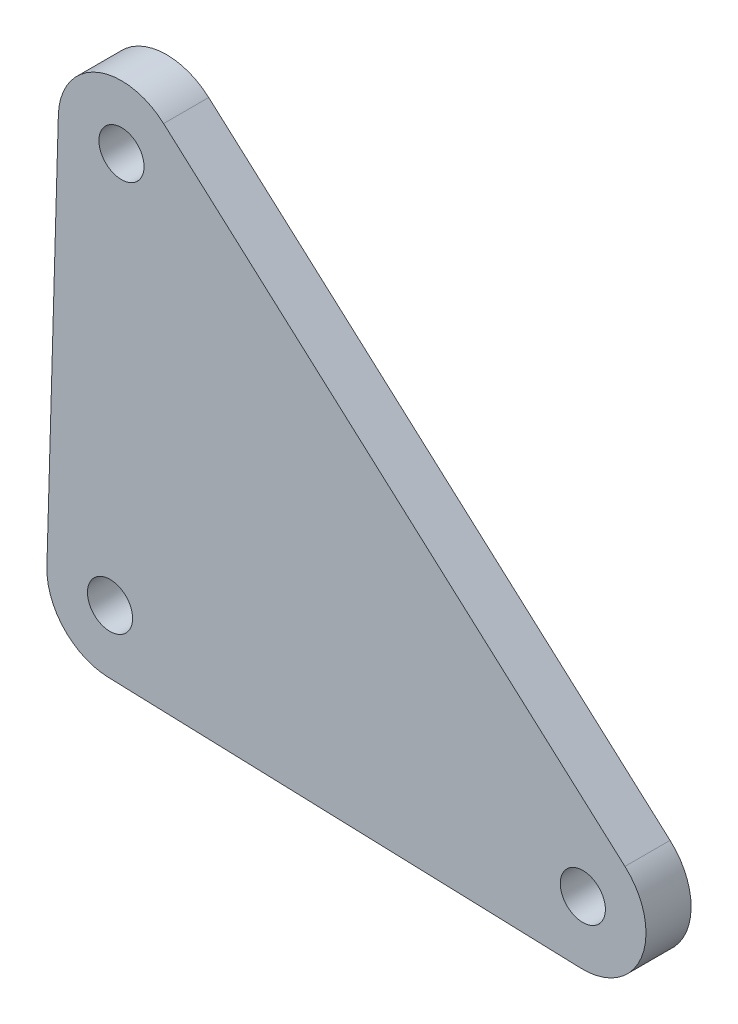
ISO-10303-21;
HEADER;
FILE_DESCRIPTION(('STEP AP214'),'2;1');
FILE_NAME('part.step','',(''),(''),'','','');
FILE_SCHEMA(('AUTOMOTIVE_DESIGN { 1 0 10303 214 1 1 1 1 }'));
ENDSEC;
DATA;
#1=APPLICATION_CONTEXT('core data for automotive mechanical design processes');
#2=APPLICATION_PROTOCOL_DEFINITION('international standard','automotive_design',2000,#1);
#3=PRODUCT_CONTEXT('',#1,'mechanical');
#4=PRODUCT('Part','Part','',(#3));
#5=PRODUCT_RELATED_PRODUCT_CATEGORY('part','',(#4));
#6=PRODUCT_DEFINITION_FORMATION('','',#4);
#7=PRODUCT_DEFINITION_CONTEXT('part definition',#1,'design');
#8=PRODUCT_DEFINITION('design','',#6,#7);
#9=PRODUCT_DEFINITION_SHAPE('','',#8);
#10=(LENGTH_UNIT() NAMED_UNIT(*) SI_UNIT(.MILLI.,.METRE.));
#11=(NAMED_UNIT(*) PLANE_ANGLE_UNIT() SI_UNIT($,.RADIAN.));
#12=(NAMED_UNIT(*) SI_UNIT($,.STERADIAN.) SOLID_ANGLE_UNIT());
#13=UNCERTAINTY_MEASURE_WITH_UNIT(LENGTH_MEASURE(1.E-05),#10,'distance_accuracy_value','');
#14=(GEOMETRIC_REPRESENTATION_CONTEXT(3) GLOBAL_UNCERTAINTY_ASSIGNED_CONTEXT((#13)) GLOBAL_UNIT_ASSIGNED_CONTEXT((#10,
#11,#12)) REPRESENTATION_CONTEXT('',''));
#15=CARTESIAN_POINT('',(0.,0.,0.));
#16=DIRECTION('',(0.,0.,1.));
#17=DIRECTION('',(1.,0.,0.));
#18=AXIS2_PLACEMENT_3D('',#15,#16,#17);
#19=CARTESIAN_POINT('',(0.,0.,6.35));
#20=DIRECTION('',(0.,0.,-1.));
#21=DIRECTION('',(-1.,0.,0.));
#22=AXIS2_PLACEMENT_3D('',#19,#20,#21);
#23=PLANE('',#22);
#24=DIRECTION('',(0.999452310501451,-0.0330919783831676,0.));
#25=VECTOR('',#24,1.);
#26=CARTESIAN_POINT('',(90.721451865016,-11.8986691001195,6.35));
#27=LINE('',#26,#25);
#28=CARTESIAN_POINT('',(-0.294187687826367,-8.88513104035789,6.35));
#29=VERTEX_POINT('',#28);
#30=CARTESIAN_POINT('',(66.2538123121736,-11.0885428032845,6.35));
#31=VERTEX_POINT('',#30);
#32=EDGE_CURVE('E132',#29,#31,#27,.T.);
#33=ORIENTED_EDGE('',*,*,#32,.T.);
#34=CARTESIAN_POINT('',(66.548,-2.20341176292657,6.35));
#35=DIRECTION('',(0.,0.,-1.));
#36=DIRECTION('',(-1.,0.,0.));
#37=AXIS2_PLACEMENT_3D('',#34,#35,#36);
#38=CIRCLE('',#37,8.89);
#39=CARTESIAN_POINT('',(72.474878751319,4.42261331000841,6.35));
#40=VERTEX_POINT('',#39);
#41=EDGE_CURVE('E158',#31,#40,#38,.F.);
#42=ORIENTED_EDGE('',*,*,#41,.T.);
#43=DIRECTION('',(-0.74533465387345,0.666690523207991,0.));
#44=VECTOR('',#43,1.);
#45=CARTESIAN_POINT('',(-6.7212836463677,75.2623772611201,6.35));
#46=LINE('',#45,#44);
#47=CARTESIAN_POINT('',(7.53983303655631,62.506025072935,6.35));
#48=VERTEX_POINT('',#47);
#49=EDGE_CURVE('E123',#40,#48,#46,.T.);
#50=ORIENTED_EDGE('',*,*,#49,.T.);
#51=CARTESIAN_POINT('',(1.61295428523728,55.88,6.35));
#52=DIRECTION('',(0.,0.,-1.));
#53=DIRECTION('',(-1.,0.,0.));
#54=AXIS2_PLACEMENT_3D('',#51,#52,#53);
#55=CIRCLE('',#54,8.89);
#56=CARTESIAN_POINT('',(-7.27334460630463,56.1364995325163,6.35));
#57=VERTEX_POINT('',#56);
#58=EDGE_CURVE('E66',#48,#57,#55,.F.);
#59=ORIENTED_EDGE('',*,*,#58,.T.);
#60=DIRECTION('',(-0.0288525908342314,-0.999583677338797,0.));
#61=VECTOR('',#60,1.);
#62=CARTESIAN_POINT('',(-9.14171280104521,-8.59218848900767,6.35));
#63=LINE('',#62,#61);
#64=CARTESIAN_POINT('',(-8.8862988915419,0.256499532516313,6.35));
#65=VERTEX_POINT('',#64);
#66=EDGE_CURVE('E142',#57,#65,#63,.T.);
#67=ORIENTED_EDGE('',*,*,#66,.T.);
#68=CARTESIAN_POINT('',(0.,0.,6.35));
#69=DIRECTION('',(0.,0.,-1.));
#70=DIRECTION('',(-1.,0.,0.));
#71=AXIS2_PLACEMENT_3D('',#68,#69,#70);
#72=CIRCLE('',#71,8.89);
#73=EDGE_CURVE('E154',#65,#29,#72,.F.);
#74=ORIENTED_EDGE('',*,*,#73,.T.);
#75=EDGE_LOOP('',(#33,#42,#50,#59,#67,#74));
#76=FACE_BOUND('',#75,.T.);
#77=CARTESIAN_POINT('',(1.61295428523728,55.88,6.35));
#78=DIRECTION('',(0.,0.,1.));
#79=DIRECTION('',(1.,0.,0.));
#80=AXIS2_PLACEMENT_3D('',#77,#78,#79);
#81=CIRCLE('',#80,3.175);
#82=CARTESIAN_POINT('',(4.78795428523728,55.88,6.35));
#83=VERTEX_POINT('',#82);
#84=EDGE_CURVE('E139',#83,#83,#81,.T.);
#85=ORIENTED_EDGE('',*,*,#84,.F.);
#86=EDGE_LOOP('',(#85));
#87=FACE_BOUND('',#86,.T.);
#88=CARTESIAN_POINT('',(0.,0.,6.35));
#89=DIRECTION('',(0.,0.,1.));
#90=DIRECTION('',(1.,0.,0.));
#91=AXIS2_PLACEMENT_3D('',#88,#89,#90);
#92=CIRCLE('',#91,3.175);
#93=CARTESIAN_POINT('',(3.175,0.,6.35));
#94=VERTEX_POINT('',#93);
#95=EDGE_CURVE('E187',#94,#94,#92,.T.);
#96=ORIENTED_EDGE('',*,*,#95,.F.);
#97=EDGE_LOOP('',(#96));
#98=FACE_BOUND('',#97,.T.);
#99=CARTESIAN_POINT('',(66.548,-2.20341176292657,6.35));
#100=DIRECTION('',(0.,0.,1.));
#101=DIRECTION('',(1.,0.,0.));
#102=AXIS2_PLACEMENT_3D('',#99,#100,#101);
#103=CIRCLE('',#102,3.175);
#104=CARTESIAN_POINT('',(69.723,-2.20341176292657,6.35));
#105=VERTEX_POINT('',#104);
#106=EDGE_CURVE('E192',#105,#105,#103,.T.);
#107=ORIENTED_EDGE('',*,*,#106,.F.);
#108=EDGE_LOOP('',(#107));
#109=FACE_BOUND('',#108,.T.);
#110=ADVANCED_FACE('F50',(#76,#87,#98,#109),#23,.F.);
#111=CARTESIAN_POINT('',(0.,0.,0.));
#112=DIRECTION('',(0.,0.,-1.));
#113=DIRECTION('',(-1.,0.,0.));
#114=AXIS2_PLACEMENT_3D('',#111,#112,#113);
#115=PLANE('',#114);
#116=CARTESIAN_POINT('',(0.,0.,0.));
#117=DIRECTION('',(0.,0.,1.));
#118=DIRECTION('',(1.,0.,0.));
#119=AXIS2_PLACEMENT_3D('',#116,#117,#118);
#120=CIRCLE('',#119,3.175);
#121=CARTESIAN_POINT('',(3.175,0.,0.));
#122=VERTEX_POINT('',#121);
#123=EDGE_CURVE('E198',#122,#122,#120,.T.);
#124=ORIENTED_EDGE('',*,*,#123,.T.);
#125=EDGE_LOOP('',(#124));
#126=FACE_BOUND('',#125,.T.);
#127=DIRECTION('',(-0.74533465387345,0.666690523207991,0.));
#128=VECTOR('',#127,1.);
#129=CARTESIAN_POINT('',(-6.7212836463677,75.2623772611201,0.));
#130=LINE('',#129,#128);
#131=CARTESIAN_POINT('',(72.474878751319,4.42261331000841,0.));
#132=VERTEX_POINT('',#131);
#133=CARTESIAN_POINT('',(7.53983303655631,62.506025072935,0.));
#134=VERTEX_POINT('',#133);
#135=EDGE_CURVE('E119',#132,#134,#130,.T.);
#136=ORIENTED_EDGE('',*,*,#135,.F.);
#137=CARTESIAN_POINT('',(66.548,-2.20341176292657,0.));
#138=DIRECTION('',(0.,0.,-1.));
#139=DIRECTION('',(-1.,0.,0.));
#140=AXIS2_PLACEMENT_3D('',#137,#138,#139);
#141=CIRCLE('',#140,8.89);
#142=CARTESIAN_POINT('',(66.2538123121736,-11.0885428032845,0.));
#143=VERTEX_POINT('',#142);
#144=EDGE_CURVE('E101',#132,#143,#141,.T.);
#145=ORIENTED_EDGE('',*,*,#144,.T.);
#146=DIRECTION('',(0.999452310501451,-0.0330919783831676,0.));
#147=VECTOR('',#146,1.);
#148=CARTESIAN_POINT('',(90.721451865016,-11.8986691001195,0.));
#149=LINE('',#148,#147);
#150=CARTESIAN_POINT('',(-0.294187687826367,-8.88513104035789,0.));
#151=VERTEX_POINT('',#150);
#152=EDGE_CURVE('E133',#151,#143,#149,.T.);
#153=ORIENTED_EDGE('',*,*,#152,.F.);
#154=CARTESIAN_POINT('',(0.,0.,0.));
#155=DIRECTION('',(0.,0.,-1.));
#156=DIRECTION('',(-1.,0.,0.));
#157=AXIS2_PLACEMENT_3D('',#154,#155,#156);
#158=CIRCLE('',#157,8.89);
#159=CARTESIAN_POINT('',(-8.8862988915419,0.256499532516313,0.));
#160=VERTEX_POINT('',#159);
#161=EDGE_CURVE('E114',#151,#160,#158,.T.);
#162=ORIENTED_EDGE('',*,*,#161,.T.);
#163=DIRECTION('',(-0.0288525908342314,-0.999583677338797,0.));
#164=VECTOR('',#163,1.);
#165=CARTESIAN_POINT('',(-9.14171280104521,-8.59218848900767,0.));
#166=LINE('',#165,#164);
#167=CARTESIAN_POINT('',(-7.27334460630463,56.1364995325163,0.));
#168=VERTEX_POINT('',#167);
#169=EDGE_CURVE('E128',#168,#160,#166,.T.);
#170=ORIENTED_EDGE('',*,*,#169,.F.);
#171=CARTESIAN_POINT('',(1.61295428523728,55.88,0.));
#172=DIRECTION('',(0.,0.,-1.));
#173=DIRECTION('',(-1.,0.,0.));
#174=AXIS2_PLACEMENT_3D('',#171,#172,#173);
#175=CIRCLE('',#174,8.89);
#176=EDGE_CURVE('E121',#168,#134,#175,.T.);
#177=ORIENTED_EDGE('',*,*,#176,.T.);
#178=EDGE_LOOP('',(#136,#145,#153,#162,#170,#177));
#179=FACE_BOUND('',#178,.T.);
#180=CARTESIAN_POINT('',(1.61295428523728,55.88,0.));
#181=DIRECTION('',(0.,0.,1.));
#182=DIRECTION('',(1.,0.,0.));
#183=AXIS2_PLACEMENT_3D('',#180,#181,#182);
#184=CIRCLE('',#183,3.175);
#185=CARTESIAN_POINT('',(4.78795428523728,55.88,0.));
#186=VERTEX_POINT('',#185);
#187=EDGE_CURVE('E176',#186,#186,#184,.T.);
#188=ORIENTED_EDGE('',*,*,#187,.T.);
#189=EDGE_LOOP('',(#188));
#190=FACE_BOUND('',#189,.T.);
#191=CARTESIAN_POINT('',(66.548,-2.20341176292657,0.));
#192=DIRECTION('',(0.,0.,1.));
#193=DIRECTION('',(1.,0.,0.));
#194=AXIS2_PLACEMENT_3D('',#191,#192,#193);
#195=CIRCLE('',#194,3.175);
#196=CARTESIAN_POINT('',(69.723,-2.20341176292657,0.));
#197=VERTEX_POINT('',#196);
#198=EDGE_CURVE('E197',#197,#197,#195,.T.);
#199=ORIENTED_EDGE('',*,*,#198,.T.);
#200=EDGE_LOOP('',(#199));
#201=FACE_BOUND('',#200,.T.);
#202=ADVANCED_FACE('F127',(#126,#179,#190,#201),#115,.T.);
#203=CARTESIAN_POINT('',(90.721451865016,-11.8986691001195,6.35));
#204=DIRECTION('',(0.0330919783831676,0.999452310501451,0.));
#205=DIRECTION('',(-0.999452310501451,0.0330919783831676,0.));
#206=AXIS2_PLACEMENT_3D('',#203,#204,#205);
#207=PLANE('',#206);
#208=ORIENTED_EDGE('',*,*,#152,.T.);
#209=DIRECTION('',(0.,0.,-1.));
#210=VECTOR('',#209,1.);
#211=CARTESIAN_POINT('',(66.2538123121736,-11.0885428032845,6.35));
#212=LINE('',#211,#210);
#213=EDGE_CURVE('E106',#143,#31,#212,.F.);
#214=ORIENTED_EDGE('',*,*,#213,.T.);
#215=ORIENTED_EDGE('',*,*,#32,.F.);
#216=DIRECTION('',(0.,0.,-1.));
#217=VECTOR('',#216,1.);
#218=CARTESIAN_POINT('',(-0.294187687826367,-8.88513104035789,6.35));
#219=LINE('',#218,#217);
#220=EDGE_CURVE('E115',#29,#151,#219,.T.);
#221=ORIENTED_EDGE('',*,*,#220,.T.);
#222=EDGE_LOOP('',(#208,#214,#215,#221));
#223=FACE_BOUND('',#222,.T.);
#224=ADVANCED_FACE('F173',(#223),#207,.F.);
#225=CARTESIAN_POINT('',(-6.7212836463677,75.2623772611201,6.35));
#226=DIRECTION('',(-0.666690523207991,-0.74533465387345,0.));
#227=DIRECTION('',(0.74533465387345,-0.666690523207991,0.));
#228=AXIS2_PLACEMENT_3D('',#225,#226,#227);
#229=PLANE('',#228);
#230=ORIENTED_EDGE('',*,*,#49,.F.);
#231=DIRECTION('',(0.,0.,-1.));
#232=VECTOR('',#231,1.);
#233=CARTESIAN_POINT('',(72.474878751319,4.42261331000839,6.35));
#234=LINE('',#233,#232);
#235=EDGE_CURVE('E104',#40,#132,#234,.T.);
#236=ORIENTED_EDGE('',*,*,#235,.T.);
#237=ORIENTED_EDGE('',*,*,#135,.T.);
#238=DIRECTION('',(0.,0.,-1.));
#239=VECTOR('',#238,1.);
#240=CARTESIAN_POINT('',(7.53983303655632,62.506025072935,6.35));
#241=LINE('',#240,#239);
#242=EDGE_CURVE('E124',#134,#48,#241,.F.);
#243=ORIENTED_EDGE('',*,*,#242,.T.);
#244=EDGE_LOOP('',(#230,#236,#237,#243));
#245=FACE_BOUND('',#244,.T.);
#246=ADVANCED_FACE('F116',(#245),#229,.F.);
#247=CARTESIAN_POINT('',(-9.14171280104521,-8.59218848900767,6.35));
#248=DIRECTION('',(0.999583677338797,-0.0288525908342314,0.));
#249=DIRECTION('',(0.0288525908342314,0.999583677338797,0.));
#250=AXIS2_PLACEMENT_3D('',#247,#248,#249);
#251=PLANE('',#250);
#252=ORIENTED_EDGE('',*,*,#169,.T.);
#253=DIRECTION('',(0.,0.,-1.));
#254=VECTOR('',#253,1.);
#255=CARTESIAN_POINT('',(-8.8862988915419,0.256499532516314,6.35));
#256=LINE('',#255,#254);
#257=EDGE_CURVE('E11',#160,#65,#256,.F.);
#258=ORIENTED_EDGE('',*,*,#257,.T.);
#259=ORIENTED_EDGE('',*,*,#66,.F.);
#260=DIRECTION('',(0.,0.,-1.));
#261=VECTOR('',#260,1.);
#262=CARTESIAN_POINT('',(-7.27334460630463,56.1364995325163,6.35));
#263=LINE('',#262,#261);
#264=EDGE_CURVE('E57',#57,#168,#263,.T.);
#265=ORIENTED_EDGE('',*,*,#264,.T.);
#266=EDGE_LOOP('',(#252,#258,#259,#265));
#267=FACE_BOUND('',#266,.T.);
#268=ADVANCED_FACE('F162',(#267),#251,.F.);
#269=CARTESIAN_POINT('',(1.61295428523728,55.88,6.35));
#270=DIRECTION('',(0.,0.,-1.));
#271=DIRECTION('',(-1.,0.,0.));
#272=AXIS2_PLACEMENT_3D('',#269,#270,#271);
#273=CYLINDRICAL_SURFACE('',#272,3.175);
#274=ORIENTED_EDGE('',*,*,#84,.T.);
#275=EDGE_LOOP('',(#274));
#276=FACE_BOUND('',#275,.T.);
#277=ORIENTED_EDGE('',*,*,#187,.F.);
#278=EDGE_LOOP('',(#277));
#279=FACE_BOUND('',#278,.T.);
#280=ADVANCED_FACE('F212',(#276,#279),#273,.F.);
#281=CARTESIAN_POINT('',(0.,0.,6.35));
#282=DIRECTION('',(0.,0.,-1.));
#283=DIRECTION('',(-1.,0.,0.));
#284=AXIS2_PLACEMENT_3D('',#281,#282,#283);
#285=CYLINDRICAL_SURFACE('',#284,3.175);
#286=ORIENTED_EDGE('',*,*,#95,.T.);
#287=EDGE_LOOP('',(#286));
#288=FACE_BOUND('',#287,.T.);
#289=ORIENTED_EDGE('',*,*,#123,.F.);
#290=EDGE_LOOP('',(#289));
#291=FACE_BOUND('',#290,.T.);
#292=ADVANCED_FACE('F216',(#288,#291),#285,.F.);
#293=CARTESIAN_POINT('',(66.548,-2.20341176292657,6.35));
#294=DIRECTION('',(0.,0.,-1.));
#295=DIRECTION('',(-1.,0.,0.));
#296=AXIS2_PLACEMENT_3D('',#293,#294,#295);
#297=CYLINDRICAL_SURFACE('',#296,3.175);
#298=ORIENTED_EDGE('',*,*,#106,.T.);
#299=EDGE_LOOP('',(#298));
#300=FACE_BOUND('',#299,.T.);
#301=ORIENTED_EDGE('',*,*,#198,.F.);
#302=EDGE_LOOP('',(#301));
#303=FACE_BOUND('',#302,.T.);
#304=ADVANCED_FACE('F222',(#300,#303),#297,.F.);
#305=CARTESIAN_POINT('',(66.548,-2.20341176292657,6.35));
#306=DIRECTION('',(0.,0.,-1.));
#307=DIRECTION('',(-1.,0.,0.));
#308=AXIS2_PLACEMENT_3D('',#305,#306,#307);
#309=CYLINDRICAL_SURFACE('',#308,8.89);
#310=ORIENTED_EDGE('',*,*,#41,.F.);
#311=ORIENTED_EDGE('',*,*,#213,.F.);
#312=ORIENTED_EDGE('',*,*,#144,.F.);
#313=ORIENTED_EDGE('',*,*,#235,.F.);
#314=EDGE_LOOP('',(#310,#311,#312,#313));
#315=FACE_BOUND('',#314,.T.);
#316=ADVANCED_FACE('F102',(#315),#309,.T.);
#317=CARTESIAN_POINT('',(0.,0.,6.35));
#318=DIRECTION('',(0.,0.,-1.));
#319=DIRECTION('',(-1.,0.,0.));
#320=AXIS2_PLACEMENT_3D('',#317,#318,#319);
#321=CYLINDRICAL_SURFACE('',#320,8.89);
#322=ORIENTED_EDGE('',*,*,#73,.F.);
#323=ORIENTED_EDGE('',*,*,#257,.F.);
#324=ORIENTED_EDGE('',*,*,#161,.F.);
#325=ORIENTED_EDGE('',*,*,#220,.F.);
#326=EDGE_LOOP('',(#322,#323,#324,#325));
#327=FACE_BOUND('',#326,.T.);
#328=ADVANCED_FACE('F169',(#327),#321,.T.);
#329=CARTESIAN_POINT('',(1.61295428523728,55.88,6.35));
#330=DIRECTION('',(0.,0.,-1.));
#331=DIRECTION('',(-1.,0.,0.));
#332=AXIS2_PLACEMENT_3D('',#329,#330,#331);
#333=CYLINDRICAL_SURFACE('',#332,8.89);
#334=ORIENTED_EDGE('',*,*,#58,.F.);
#335=ORIENTED_EDGE('',*,*,#242,.F.);
#336=ORIENTED_EDGE('',*,*,#176,.F.);
#337=ORIENTED_EDGE('',*,*,#264,.F.);
#338=EDGE_LOOP('',(#334,#335,#336,#337));
#339=FACE_BOUND('',#338,.T.);
#340=ADVANCED_FACE('F47',(#339),#333,.T.);
#341=CLOSED_SHELL('',(#110,#202,#224,#246,#268,#280,#292,#304,#316,#328,#340));
#342=MANIFOLD_SOLID_BREP('B2',#341);
#343=ADVANCED_BREP_SHAPE_REPRESENTATION('',(#18,#342),#14);
#344=SHAPE_DEFINITION_REPRESENTATION(#9,#343);
ENDSEC;
END-ISO-10303-21;
